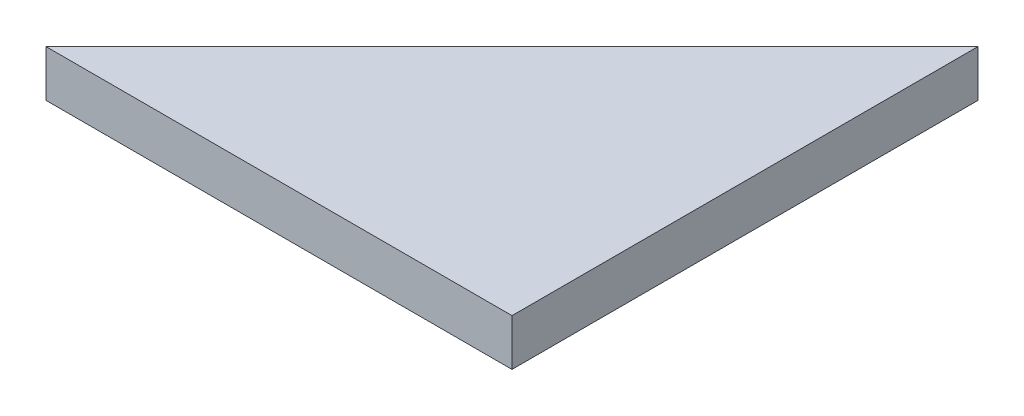
ISO-10303-21;
HEADER;
FILE_DESCRIPTION(('STEP AP214'),'2;1');
FILE_NAME('part.step','',(''),(''),'','','');
FILE_SCHEMA(('AUTOMOTIVE_DESIGN { 1 0 10303 214 1 1 1 1 }'));
ENDSEC;
DATA;
#1=APPLICATION_CONTEXT('core data for automotive mechanical design processes');
#2=APPLICATION_PROTOCOL_DEFINITION('international standard','automotive_design',2000,#1);
#3=PRODUCT_CONTEXT('',#1,'mechanical');
#4=PRODUCT('Part','Part','',(#3));
#5=PRODUCT_RELATED_PRODUCT_CATEGORY('part','',(#4));
#6=PRODUCT_DEFINITION_FORMATION('','',#4);
#7=PRODUCT_DEFINITION_CONTEXT('part definition',#1,'design');
#8=PRODUCT_DEFINITION('design','',#6,#7);
#9=PRODUCT_DEFINITION_SHAPE('','',#8);
#10=(LENGTH_UNIT() NAMED_UNIT(*) SI_UNIT(.MILLI.,.METRE.));
#11=(NAMED_UNIT(*) PLANE_ANGLE_UNIT() SI_UNIT($,.RADIAN.));
#12=(NAMED_UNIT(*) SI_UNIT($,.STERADIAN.) SOLID_ANGLE_UNIT());
#13=UNCERTAINTY_MEASURE_WITH_UNIT(LENGTH_MEASURE(1.E-05),#10,'distance_accuracy_value','');
#14=(GEOMETRIC_REPRESENTATION_CONTEXT(3) GLOBAL_UNCERTAINTY_ASSIGNED_CONTEXT((#13)) GLOBAL_UNIT_ASSIGNED_CONTEXT((#10,
#11,#12)) REPRESENTATION_CONTEXT('',''));
#15=CARTESIAN_POINT('',(0.,0.,0.));
#16=DIRECTION('',(0.,0.,1.));
#17=DIRECTION('',(1.,0.,0.));
#18=AXIS2_PLACEMENT_3D('',#15,#16,#17);
#19=CARTESIAN_POINT('',(0.,3.,-30.));
#20=DIRECTION('',(-1.,0.,0.));
#21=DIRECTION('',(0.,0.,1.));
#22=AXIS2_PLACEMENT_3D('',#19,#20,#21);
#23=PLANE('',#22);
#24=DIRECTION('',(0.,0.,-1.));
#25=VECTOR('',#24,1.);
#26=CARTESIAN_POINT('',(0.,0.,-30.));
#27=LINE('',#26,#25);
#28=CARTESIAN_POINT('',(0.,0.,0.));
#29=VERTEX_POINT('',#28);
#30=CARTESIAN_POINT('',(0.,0.,-30.));
#31=VERTEX_POINT('',#30);
#32=EDGE_CURVE('E89',#29,#31,#27,.T.);
#33=ORIENTED_EDGE('',*,*,#32,.T.);
#34=DIRECTION('',(0.,-1.,0.));
#35=VECTOR('',#34,1.);
#36=CARTESIAN_POINT('',(0.,3.,-30.));
#37=LINE('',#36,#35);
#38=CARTESIAN_POINT('',(0.,3.,-30.));
#39=VERTEX_POINT('',#38);
#40=EDGE_CURVE('E11',#39,#31,#37,.T.);
#41=ORIENTED_EDGE('',*,*,#40,.F.);
#42=DIRECTION('',(0.,0.,-1.));
#43=VECTOR('',#42,1.);
#44=CARTESIAN_POINT('',(0.,3.,-30.));
#45=LINE('',#44,#43);
#46=CARTESIAN_POINT('',(0.,3.,0.));
#47=VERTEX_POINT('',#46);
#48=EDGE_CURVE('E81',#47,#39,#45,.T.);
#49=ORIENTED_EDGE('',*,*,#48,.F.);
#50=DIRECTION('',(0.,-1.,0.));
#51=VECTOR('',#50,1.);
#52=CARTESIAN_POINT('',(0.,3.,0.));
#53=LINE('',#52,#51);
#54=EDGE_CURVE('E90',#47,#29,#53,.T.);
#55=ORIENTED_EDGE('',*,*,#54,.T.);
#56=EDGE_LOOP('',(#33,#41,#49,#55));
#57=FACE_BOUND('',#56,.T.);
#58=ADVANCED_FACE('F39',(#57),#23,.F.);
#59=CARTESIAN_POINT('',(-30.0000000000003,3.,0.));
#60=DIRECTION('',(0.707106781186544,0.,0.707106781186551));
#61=DIRECTION('',(0.707106781186551,0.,-0.707106781186544));
#62=AXIS2_PLACEMENT_3D('',#59,#60,#61);
#63=PLANE('',#62);
#64=DIRECTION('',(-0.707106781186551,0.,0.707106781186544));
#65=VECTOR('',#64,1.);
#66=CARTESIAN_POINT('',(-30.0000000000003,0.,0.));
#67=LINE('',#66,#65);
#68=CARTESIAN_POINT('',(-30.0000000000003,0.,0.));
#69=VERTEX_POINT('',#68);
#70=EDGE_CURVE('E68',#31,#69,#67,.T.);
#71=ORIENTED_EDGE('',*,*,#70,.T.);
#72=DIRECTION('',(0.,-1.,0.));
#73=VECTOR('',#72,1.);
#74=CARTESIAN_POINT('',(-30.0000000000003,3.,0.));
#75=LINE('',#74,#73);
#76=CARTESIAN_POINT('',(-30.0000000000003,3.,0.));
#77=VERTEX_POINT('',#76);
#78=EDGE_CURVE('E48',#77,#69,#75,.T.);
#79=ORIENTED_EDGE('',*,*,#78,.F.);
#80=DIRECTION('',(-0.707106781186551,0.,0.707106781186544));
#81=VECTOR('',#80,1.);
#82=CARTESIAN_POINT('',(-30.0000000000003,3.,0.));
#83=LINE('',#82,#81);
#84=EDGE_CURVE('E76',#39,#77,#83,.T.);
#85=ORIENTED_EDGE('',*,*,#84,.F.);
#86=ORIENTED_EDGE('',*,*,#40,.T.);
#87=EDGE_LOOP('',(#71,#79,#85,#86));
#88=FACE_BOUND('',#87,.T.);
#89=ADVANCED_FACE('F77',(#88),#63,.F.);
#90=CARTESIAN_POINT('',(0.,3.,0.));
#91=DIRECTION('',(0.,0.,-1.));
#92=DIRECTION('',(-1.,0.,0.));
#93=AXIS2_PLACEMENT_3D('',#90,#91,#92);
#94=PLANE('',#93);
#95=DIRECTION('',(1.,0.,0.));
#96=VECTOR('',#95,1.);
#97=CARTESIAN_POINT('',(0.,0.,0.));
#98=LINE('',#97,#96);
#99=EDGE_CURVE('E73',#69,#29,#98,.T.);
#100=ORIENTED_EDGE('',*,*,#99,.T.);
#101=ORIENTED_EDGE('',*,*,#54,.F.);
#102=DIRECTION('',(1.,0.,0.));
#103=VECTOR('',#102,1.);
#104=CARTESIAN_POINT('',(0.,3.,0.));
#105=LINE('',#104,#103);
#106=EDGE_CURVE('E56',#77,#47,#105,.T.);
#107=ORIENTED_EDGE('',*,*,#106,.F.);
#108=ORIENTED_EDGE('',*,*,#78,.T.);
#109=EDGE_LOOP('',(#100,#101,#107,#108));
#110=FACE_BOUND('',#109,.T.);
#111=ADVANCED_FACE('F102',(#110),#94,.F.);
#112=CARTESIAN_POINT('',(0.,3.,0.));
#113=DIRECTION('',(0.,-1.,0.));
#114=DIRECTION('',(0.,0.,-1.));
#115=AXIS2_PLACEMENT_3D('',#112,#113,#114);
#116=PLANE('',#115);
#117=ORIENTED_EDGE('',*,*,#48,.T.);
#118=ORIENTED_EDGE('',*,*,#84,.T.);
#119=ORIENTED_EDGE('',*,*,#106,.T.);
#120=EDGE_LOOP('',(#117,#118,#119));
#121=FACE_BOUND('',#120,.T.);
#122=ADVANCED_FACE('F84',(#121),#116,.F.);
#123=CARTESIAN_POINT('',(0.,0.,0.));
#124=DIRECTION('',(0.,-1.,0.));
#125=DIRECTION('',(0.,0.,-1.));
#126=AXIS2_PLACEMENT_3D('',#123,#124,#125);
#127=PLANE('',#126);
#128=ORIENTED_EDGE('',*,*,#32,.F.);
#129=ORIENTED_EDGE('',*,*,#99,.F.);
#130=ORIENTED_EDGE('',*,*,#70,.F.);
#131=EDGE_LOOP('',(#128,#129,#130));
#132=FACE_BOUND('',#131,.T.);
#133=ADVANCED_FACE('F103',(#132),#127,.T.);
#134=CLOSED_SHELL('',(#58,#89,#111,#122,#133));
#135=MANIFOLD_SOLID_BREP('B2',#134);
#136=ADVANCED_BREP_SHAPE_REPRESENTATION('',(#18,#135),#14);
#137=SHAPE_DEFINITION_REPRESENTATION(#9,#136);
ENDSEC;
END-ISO-10303-21;
